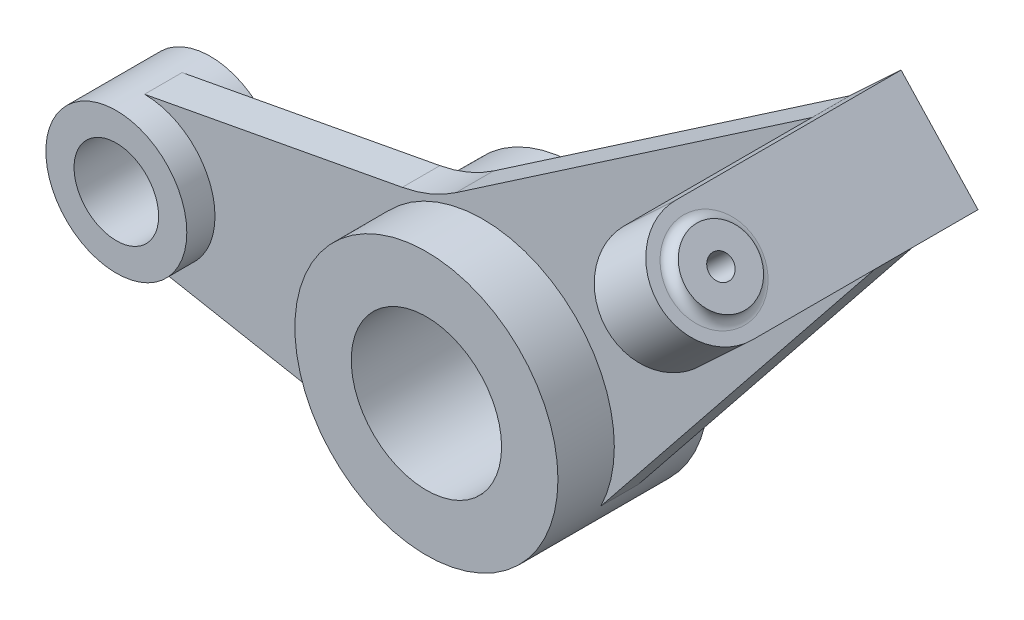
ISO-10303-21;
HEADER;
FILE_DESCRIPTION(('STEP AP214'),'2;1');
FILE_NAME('part.step','',(''),(''),'','','');
FILE_SCHEMA(('AUTOMOTIVE_DESIGN { 1 0 10303 214 1 1 1 1 }'));
ENDSEC;
DATA;
#1=APPLICATION_CONTEXT('core data for automotive mechanical design processes');
#2=APPLICATION_PROTOCOL_DEFINITION('international standard','automotive_design',2000,#1);
#3=PRODUCT_CONTEXT('',#1,'mechanical');
#4=PRODUCT('Part','Part','',(#3));
#5=PRODUCT_RELATED_PRODUCT_CATEGORY('part','',(#4));
#6=PRODUCT_DEFINITION_FORMATION('','',#4);
#7=PRODUCT_DEFINITION_CONTEXT('part definition',#1,'design');
#8=PRODUCT_DEFINITION('design','',#6,#7);
#9=PRODUCT_DEFINITION_SHAPE('','',#8);
#10=(LENGTH_UNIT() NAMED_UNIT(*) SI_UNIT(.MILLI.,.METRE.));
#11=(NAMED_UNIT(*) PLANE_ANGLE_UNIT() SI_UNIT($,.RADIAN.));
#12=(NAMED_UNIT(*) SI_UNIT($,.STERADIAN.) SOLID_ANGLE_UNIT());
#13=UNCERTAINTY_MEASURE_WITH_UNIT(LENGTH_MEASURE(1.E-05),#10,'distance_accuracy_value','');
#14=(GEOMETRIC_REPRESENTATION_CONTEXT(3) GLOBAL_UNCERTAINTY_ASSIGNED_CONTEXT((#13)) GLOBAL_UNIT_ASSIGNED_CONTEXT((#10,
#11,#12)) REPRESENTATION_CONTEXT('',''));
#15=CARTESIAN_POINT('',(0.,0.,0.));
#16=DIRECTION('',(0.,0.,1.));
#17=DIRECTION('',(1.,0.,0.));
#18=AXIS2_PLACEMENT_3D('',#15,#16,#17);
#19=CARTESIAN_POINT('',(81.0411712767887,91.980044347055,56.));
#20=DIRECTION('',(0.731353701619169,0.6819983600625,0.));
#21=DIRECTION('',(-0.6819983600625,0.731353701619169,0.));
#22=AXIS2_PLACEMENT_3D('',#19,#20,#21);
#23=PLANE('',#22);
#24=CARTESIAN_POINT('',(89.2251515975386,83.203799927625,44.));
#25=DIRECTION('',(0.731353701619169,0.6819983600625,0.));
#26=DIRECTION('',(-0.6819983600625,0.731353701619169,0.));
#27=AXIS2_PLACEMENT_3D('',#24,#25,#26);
#28=CIRCLE('',#27,9.5);
#29=CARTESIAN_POINT('',(82.7461671769449,90.1516600930071,44.));
#30=VERTEX_POINT('',#29);
#31=EDGE_CURVE('E14',#30,#30,#28,.F.);
#32=ORIENTED_EDGE('',*,*,#31,.T.);
#33=EDGE_LOOP('',(#32));
#34=FACE_BOUND('',#33,.T.);
#35=CARTESIAN_POINT('',(89.2251515975386,83.2037999276251,44.));
#36=DIRECTION('',(0.73135370161917,0.681998360062499,0.));
#37=DIRECTION('',(-0.681998360062499,0.73135370161917,0.));
#38=AXIS2_PLACEMENT_3D('',#35,#36,#37);
#39=CIRCLE('',#38,12.);
#40=CARTESIAN_POINT('',(81.0411712767887,91.980044347055,44.));
#41=VERTEX_POINT('',#40);
#42=CARTESIAN_POINT('',(97.4091319182887,74.4275555081949,44.));
#43=VERTEX_POINT('',#42);
#44=EDGE_CURVE('E147',#41,#43,#39,.T.);
#45=ORIENTED_EDGE('',*,*,#44,.T.);
#46=DIRECTION('',(0.,0.,-1.));
#47=VECTOR('',#46,1.);
#48=CARTESIAN_POINT('',(97.4091319182887,74.4275555081949,56.));
#49=LINE('',#48,#47);
#50=CARTESIAN_POINT('',(97.4091319182887,74.4275555081949,-4.));
#51=VERTEX_POINT('',#50);
#52=EDGE_CURVE('E151',#43,#51,#49,.T.);
#53=ORIENTED_EDGE('',*,*,#52,.T.);
#54=DIRECTION('',(0.6819983600625,-0.731353701619169,0.));
#55=VECTOR('',#54,1.);
#56=CARTESIAN_POINT('',(81.0411712767887,91.980044347055,-4.));
#57=LINE('',#56,#55);
#58=CARTESIAN_POINT('',(81.0411712767887,91.980044347055,-4.));
#59=VERTEX_POINT('',#58);
#60=EDGE_CURVE('E363',#59,#51,#57,.T.);
#61=ORIENTED_EDGE('',*,*,#60,.F.);
#62=DIRECTION('',(0.,0.,-1.));
#63=VECTOR('',#62,1.);
#64=CARTESIAN_POINT('',(81.0411712767887,91.980044347055,56.));
#65=LINE('',#64,#63);
#66=EDGE_CURVE('E153',#41,#59,#65,.T.);
#67=ORIENTED_EDGE('',*,*,#66,.F.);
#68=EDGE_LOOP('',(#45,#53,#61,#67));
#69=FACE_BOUND('',#68,.T.);
#70=ADVANCED_FACE('F63',(#34,#69),#23,.T.);
#71=CARTESIAN_POINT('',(70.0708657525011,81.7500689461175,56.));
#72=DIRECTION('',(-0.731353701619169,-0.6819983600625,0.));
#73=DIRECTION('',(0.6819983600625,-0.731353701619169,0.));
#74=AXIS2_PLACEMENT_3D('',#71,#72,#73);
#75=PLANE('',#74);
#76=CARTESIAN_POINT('',(78.2548460732511,72.9738245266875,44.));
#77=DIRECTION('',(-0.73135370161917,-0.681998360062499,0.));
#78=DIRECTION('',(0.681998360062499,-0.73135370161917,0.));
#79=AXIS2_PLACEMENT_3D('',#76,#77,#78);
#80=CIRCLE('',#79,6.00000000000001);
#81=CARTESIAN_POINT('',(82.3468362336261,68.5857023169725,44.));
#82=VERTEX_POINT('',#81);
#83=EDGE_CURVE('E375',#82,#82,#80,.T.);
#84=ORIENTED_EDGE('',*,*,#83,.F.);
#85=EDGE_LOOP('',(#84));
#86=FACE_BOUND('',#85,.T.);
#87=DIRECTION('',(0.,0.,-1.));
#88=VECTOR('',#87,1.);
#89=CARTESIAN_POINT('',(86.4388263940011,64.1975801072574,56.));
#90=LINE('',#89,#88);
#91=CARTESIAN_POINT('',(86.4388263940011,64.1975801072575,44.));
#92=VERTEX_POINT('',#91);
#93=CARTESIAN_POINT('',(86.4388263940011,64.1975801072574,4.));
#94=VERTEX_POINT('',#93);
#95=EDGE_CURVE('E171',#92,#94,#90,.T.);
#96=ORIENTED_EDGE('',*,*,#95,.F.);
#97=CARTESIAN_POINT('',(78.254846073251,72.9738245266875,44.));
#98=DIRECTION('',(-0.731353701619169,-0.6819983600625,0.));
#99=DIRECTION('',(0.6819983600625,-0.731353701619169,0.));
#100=AXIS2_PLACEMENT_3D('',#97,#98,#99);
#101=CIRCLE('',#100,12.);
#102=CARTESIAN_POINT('',(70.0708657525012,81.7500689461176,44.));
#103=VERTEX_POINT('',#102);
#104=EDGE_CURVE('E162',#92,#103,#101,.T.);
#105=ORIENTED_EDGE('',*,*,#104,.T.);
#106=DIRECTION('',(0.,0.,-1.));
#107=VECTOR('',#106,1.);
#108=CARTESIAN_POINT('',(70.0708657525011,81.7500689461175,56.));
#109=LINE('',#108,#107);
#110=CARTESIAN_POINT('',(70.0708657525011,81.7500689461175,4.));
#111=VERTEX_POINT('',#110);
#112=EDGE_CURVE('E175',#103,#111,#109,.T.);
#113=ORIENTED_EDGE('',*,*,#112,.T.);
#114=DIRECTION('',(-0.6819983600625,0.731353701619169,0.));
#115=VECTOR('',#114,1.);
#116=CARTESIAN_POINT('',(70.0708657525011,81.7500689461175,4.));
#117=LINE('',#116,#115);
#118=EDGE_CURVE('E186',#94,#111,#117,.T.);
#119=ORIENTED_EDGE('',*,*,#118,.F.);
#120=EDGE_LOOP('',(#96,#105,#113,#119));
#121=FACE_BOUND('',#120,.T.);
#122=ADVANCED_FACE('F278',(#86,#121),#75,.T.);
#123=CARTESIAN_POINT('',(70.0708657525011,81.7500689461175,56.));
#124=DIRECTION('',(-0.681998360062499,0.731353701619169,0.));
#125=DIRECTION('',(-0.73135370161917,-0.6819983600625,0.));
#126=AXIS2_PLACEMENT_3D('',#123,#124,#125);
#127=PLANE('',#126);
#128=ORIENTED_EDGE('',*,*,#112,.F.);
#129=DIRECTION('',(0.73135370161917,0.681998360062499,0.));
#130=VECTOR('',#129,1.);
#131=CARTESIAN_POINT('',(-68.6842836322569,-47.6412011344546,44.));
#132=LINE('',#131,#130);
#133=EDGE_CURVE('E156',#103,#41,#132,.T.);
#134=ORIENTED_EDGE('',*,*,#133,.T.);
#135=ORIENTED_EDGE('',*,*,#66,.T.);
#136=DIRECTION('',(0.731353701619169,0.681998360062499,0.));
#137=VECTOR('',#136,1.);
#138=CARTESIAN_POINT('',(70.0708657525011,81.7500689461175,-4.));
#139=LINE('',#138,#137);
#140=CARTESIAN_POINT('',(70.0708657525011,81.7500689461175,-4.));
#141=VERTEX_POINT('',#140);
#142=EDGE_CURVE('E364',#141,#59,#139,.T.);
#143=ORIENTED_EDGE('',*,*,#142,.F.);
#144=DIRECTION('',(0.,0.,-1.));
#145=VECTOR('',#144,1.);
#146=CARTESIAN_POINT('',(70.0708657525011,81.7500689461175,4.));
#147=LINE('',#146,#145);
#148=EDGE_CURVE('E189',#111,#141,#147,.T.);
#149=ORIENTED_EDGE('',*,*,#148,.F.);
#150=EDGE_LOOP('',(#128,#134,#135,#143,#149));
#151=FACE_BOUND('',#150,.T.);
#152=ADVANCED_FACE('F284',(#151),#127,.T.);
#153=CARTESIAN_POINT('',(-72.,15.,4.));
#154=DIRECTION('',(0.184117158780707,-0.982904304519275,0.));
#155=DIRECTION('',(0.982904304519275,0.184117158780707,0.));
#156=AXIS2_PLACEMENT_3D('',#153,#154,#155);
#157=PLANE('',#156);
#158=DIRECTION('',(-0.982904304519275,-0.184117158780707,0.));
#159=VECTOR('',#158,1.);
#160=CARTESIAN_POINT('',(-72.,15.,4.));
#161=LINE('',#160,#159);
#162=CARTESIAN_POINT('',(-17.1252828665344,25.2791054643413,4.));
#163=VERTEX_POINT('',#162);
#164=CARTESIAN_POINT('',(-72.,15.,4.));
#165=VERTEX_POINT('',#164);
#166=EDGE_CURVE('E222',#163,#165,#161,.T.);
#167=ORIENTED_EDGE('',*,*,#166,.F.);
#168=DIRECTION('',(0.,0.,-1.));
#169=VECTOR('',#168,1.);
#170=CARTESIAN_POINT('',(-17.1252828665344,25.2791054643413,-4.));
#171=LINE('',#170,#169);
#172=CARTESIAN_POINT('',(-17.1252828665344,25.2791054643413,-4.));
#173=VERTEX_POINT('',#172);
#174=EDGE_CURVE('E249',#163,#173,#171,.T.);
#175=ORIENTED_EDGE('',*,*,#174,.T.);
#176=DIRECTION('',(-0.982904304519275,-0.184117158780707,0.));
#177=VECTOR('',#176,1.);
#178=CARTESIAN_POINT('',(-72.,15.,-4.));
#179=LINE('',#178,#177);
#180=CARTESIAN_POINT('',(-72.,15.,-4.));
#181=VERTEX_POINT('',#180);
#182=EDGE_CURVE('E217',#173,#181,#179,.T.);
#183=ORIENTED_EDGE('',*,*,#182,.T.);
#184=DIRECTION('',(0.,0.,-1.));
#185=VECTOR('',#184,1.);
#186=CARTESIAN_POINT('',(-72.,15.,4.));
#187=LINE('',#186,#185);
#188=EDGE_CURVE('E224',#165,#181,#187,.T.);
#189=ORIENTED_EDGE('',*,*,#188,.F.);
#190=EDGE_LOOP('',(#167,#175,#183,#189));
#191=FACE_BOUND('',#190,.T.);
#192=ADVANCED_FACE('F263',(#191),#157,.F.);
#193=CARTESIAN_POINT('',(0.,0.,16.));
#194=DIRECTION('',(0.,0.,1.));
#195=DIRECTION('',(1.,0.,0.));
#196=AXIS2_PLACEMENT_3D('',#193,#194,#195);
#197=PLANE('',#196);
#198=CARTESIAN_POINT('',(0.,0.,16.));
#199=DIRECTION('',(0.,0.,1.));
#200=DIRECTION('',(1.,0.,0.));
#201=AXIS2_PLACEMENT_3D('',#198,#199,#200);
#202=CIRCLE('',#201,28.);
#203=CARTESIAN_POINT('',(28.,0.,16.));
#204=VERTEX_POINT('',#203);
#205=EDGE_CURVE('E246',#204,#204,#202,.T.);
#206=ORIENTED_EDGE('',*,*,#205,.T.);
#207=EDGE_LOOP('',(#206));
#208=FACE_BOUND('',#207,.T.);
#209=CARTESIAN_POINT('',(0.,0.,16.));
#210=DIRECTION('',(0.,0.,1.));
#211=DIRECTION('',(1.,0.,0.));
#212=AXIS2_PLACEMENT_3D('',#209,#210,#211);
#213=CIRCLE('',#212,16.);
#214=CARTESIAN_POINT('',(16.,0.,16.));
#215=VERTEX_POINT('',#214);
#216=EDGE_CURVE('E240',#215,#215,#213,.T.);
#217=ORIENTED_EDGE('',*,*,#216,.F.);
#218=EDGE_LOOP('',(#217));
#219=FACE_BOUND('',#218,.T.);
#220=ADVANCED_FACE('F324',(#208,#219),#197,.T.);
#221=CARTESIAN_POINT('',(0.,0.,-16.));
#222=DIRECTION('',(0.,0.,1.));
#223=DIRECTION('',(1.,0.,0.));
#224=AXIS2_PLACEMENT_3D('',#221,#222,#223);
#225=PLANE('',#224);
#226=CARTESIAN_POINT('',(0.,0.,-16.));
#227=DIRECTION('',(0.,0.,1.));
#228=DIRECTION('',(1.,0.,0.));
#229=AXIS2_PLACEMENT_3D('',#226,#227,#228);
#230=CIRCLE('',#229,28.);
#231=CARTESIAN_POINT('',(28.,0.,-16.));
#232=VERTEX_POINT('',#231);
#233=EDGE_CURVE('E243',#232,#232,#230,.T.);
#234=ORIENTED_EDGE('',*,*,#233,.F.);
#235=EDGE_LOOP('',(#234));
#236=FACE_BOUND('',#235,.T.);
#237=CARTESIAN_POINT('',(0.,0.,-16.));
#238=DIRECTION('',(0.,0.,1.));
#239=DIRECTION('',(1.,0.,0.));
#240=AXIS2_PLACEMENT_3D('',#237,#238,#239);
#241=CIRCLE('',#240,16.);
#242=CARTESIAN_POINT('',(16.,0.,-16.));
#243=VERTEX_POINT('',#242);
#244=EDGE_CURVE('E239',#243,#243,#241,.T.);
#245=ORIENTED_EDGE('',*,*,#244,.T.);
#246=EDGE_LOOP('',(#245));
#247=FACE_BOUND('',#246,.T.);
#248=ADVANCED_FACE('F335',(#236,#247),#225,.F.);
#249=CARTESIAN_POINT('',(0.,0.,16.));
#250=DIRECTION('',(0.,0.,-1.));
#251=DIRECTION('',(-1.,0.,0.));
#252=AXIS2_PLACEMENT_3D('',#249,#250,#251);
#253=CYLINDRICAL_SURFACE('',#252,28.);
#254=DIRECTION('',(0.,0.,-1.));
#255=VECTOR('',#254,1.);
#256=CARTESIAN_POINT('',(25.1229928999302,-12.362654559198,4.));
#257=LINE('',#256,#255);
#258=CARTESIAN_POINT('',(25.1229928999301,-12.362654559198,4.));
#259=VERTEX_POINT('',#258);
#260=CARTESIAN_POINT('',(25.1229928999301,-12.362654559198,-4.));
#261=VERTEX_POINT('',#260);
#262=EDGE_CURVE('E197',#259,#261,#257,.T.);
#263=ORIENTED_EDGE('',*,*,#262,.F.);
#264=CARTESIAN_POINT('',(0.,0.,4.));
#265=DIRECTION('',(0.,0.,-1.));
#266=DIRECTION('',(1.,0.,0.));
#267=AXIS2_PLACEMENT_3D('',#264,#265,#266);
#268=CIRCLE('',#267,28.);
#269=CARTESIAN_POINT('',(-5.15528044585978,-27.5213205265397,4.));
#270=VERTEX_POINT('',#269);
#271=EDGE_CURVE('E220',#270,#259,#268,.T.);
#272=ORIENTED_EDGE('',*,*,#271,.F.);
#273=DIRECTION('',(0.,0.,-1.));
#274=VECTOR('',#273,1.);
#275=CARTESIAN_POINT('',(-5.15528044585979,-27.5213205265397,4.));
#276=LINE('',#275,#274);
#277=CARTESIAN_POINT('',(-5.15528044585979,-27.5213205265397,-4.));
#278=VERTEX_POINT('',#277);
#279=EDGE_CURVE('E235',#270,#278,#276,.T.);
#280=ORIENTED_EDGE('',*,*,#279,.T.);
#281=CARTESIAN_POINT('',(0.,0.,-4.));
#282=DIRECTION('',(0.,0.,-1.));
#283=DIRECTION('',(1.,0.,0.));
#284=AXIS2_PLACEMENT_3D('',#281,#282,#283);
#285=CIRCLE('',#284,28.);
#286=EDGE_CURVE('E230',#278,#261,#285,.T.);
#287=ORIENTED_EDGE('',*,*,#286,.T.);
#288=EDGE_LOOP('',(#263,#272,#280,#287));
#289=FACE_BOUND('',#288,.T.);
#290=ORIENTED_EDGE('',*,*,#205,.F.);
#291=EDGE_LOOP('',(#290));
#292=FACE_BOUND('',#291,.T.);
#293=ORIENTED_EDGE('',*,*,#233,.T.);
#294=EDGE_LOOP('',(#293));
#295=FACE_BOUND('',#294,.T.);
#296=ADVANCED_FACE('F331',(#289,#292,#295),#253,.T.);
#297=CARTESIAN_POINT('',(0.,0.,16.));
#298=DIRECTION('',(0.,0.,-1.));
#299=DIRECTION('',(-1.,0.,0.));
#300=AXIS2_PLACEMENT_3D('',#297,#298,#299);
#301=CYLINDRICAL_SURFACE('',#300,16.);
#302=ORIENTED_EDGE('',*,*,#216,.T.);
#303=EDGE_LOOP('',(#302));
#304=FACE_BOUND('',#303,.T.);
#305=ORIENTED_EDGE('',*,*,#244,.F.);
#306=EDGE_LOOP('',(#305));
#307=FACE_BOUND('',#306,.T.);
#308=ADVANCED_FACE('F327',(#304,#307),#301,.F.);
#309=CARTESIAN_POINT('',(-72.,-15.,4.));
#310=DIRECTION('',(0.184117158780706,0.982904304519275,0.));
#311=DIRECTION('',(-0.982904304519275,0.184117158780706,0.));
#312=AXIS2_PLACEMENT_3D('',#309,#310,#311);
#313=PLANE('',#312);
#314=DIRECTION('',(0.982904304519275,-0.184117158780706,0.));
#315=VECTOR('',#314,1.);
#316=CARTESIAN_POINT('',(-72.,-15.,-4.));
#317=LINE('',#316,#315);
#318=CARTESIAN_POINT('',(-72.,-15.,-4.));
#319=VERTEX_POINT('',#318);
#320=EDGE_CURVE('E227',#319,#278,#317,.T.);
#321=ORIENTED_EDGE('',*,*,#320,.T.);
#322=ORIENTED_EDGE('',*,*,#279,.F.);
#323=DIRECTION('',(0.982904304519275,-0.184117158780706,0.));
#324=VECTOR('',#323,1.);
#325=CARTESIAN_POINT('',(-72.,-15.,4.));
#326=LINE('',#325,#324);
#327=CARTESIAN_POINT('',(-72.,-15.,4.));
#328=VERTEX_POINT('',#327);
#329=EDGE_CURVE('E216',#328,#270,#326,.T.);
#330=ORIENTED_EDGE('',*,*,#329,.F.);
#331=DIRECTION('',(0.,0.,-1.));
#332=VECTOR('',#331,1.);
#333=CARTESIAN_POINT('',(-72.,-15.,4.));
#334=LINE('',#333,#332);
#335=EDGE_CURVE('E237',#328,#319,#334,.T.);
#336=ORIENTED_EDGE('',*,*,#335,.T.);
#337=EDGE_LOOP('',(#321,#322,#330,#336));
#338=FACE_BOUND('',#337,.T.);
#339=ADVANCED_FACE('F319',(#338),#313,.F.);
#340=CARTESIAN_POINT('',(-72.,0.,4.));
#341=DIRECTION('',(0.,0.,1.));
#342=DIRECTION('',(1.,0.,0.));
#343=AXIS2_PLACEMENT_3D('',#340,#341,#342);
#344=PLANE('',#343);
#345=CARTESIAN_POINT('',(-72.,0.,4.));
#346=DIRECTION('',(0.,0.,-1.));
#347=DIRECTION('',(1.,0.,0.));
#348=AXIS2_PLACEMENT_3D('',#345,#346,#347);
#349=CIRCLE('',#348,15.);
#350=EDGE_CURVE('E213',#165,#328,#349,.T.);
#351=ORIENTED_EDGE('',*,*,#350,.T.);
#352=ORIENTED_EDGE('',*,*,#329,.T.);
#353=ORIENTED_EDGE('',*,*,#271,.T.);
#354=DIRECTION('',(0.625115474739944,0.780532281997775,0.));
#355=VECTOR('',#354,1.);
#356=CARTESIAN_POINT('',(86.4388263940011,64.1975801072574,4.));
#357=LINE('',#356,#355);
#358=EDGE_CURVE('E182',#259,#94,#357,.T.);
#359=ORIENTED_EDGE('',*,*,#358,.T.);
#360=ORIENTED_EDGE('',*,*,#118,.T.);
#361=DIRECTION('',(-0.825844339942114,-0.563898152316155,0.));
#362=VECTOR('',#361,1.);
#363=CARTESIAN_POINT('',(70.0708657525011,81.7500689461175,4.));
#364=LINE('',#363,#362);
#365=CARTESIAN_POINT('',(-5.73185306047093,29.9909044016561,4.));
#366=VERTEX_POINT('',#365);
#367=EDGE_CURVE('E180',#111,#366,#364,.T.);
#368=ORIENTED_EDGE('',*,*,#367,.T.);
#369=CARTESIAN_POINT('',(-22.6487976299556,54.7662345999195,4.));
#370=DIRECTION('',(0.,0.,1.));
#371=DIRECTION('',(1.,0.,0.));
#372=AXIS2_PLACEMENT_3D('',#369,#370,#371);
#373=CIRCLE('',#372,30.);
#374=EDGE_CURVE('E71',#366,#163,#373,.F.);
#375=ORIENTED_EDGE('',*,*,#374,.T.);
#376=ORIENTED_EDGE('',*,*,#166,.T.);
#377=EDGE_LOOP('',(#351,#352,#353,#359,#360,#368,#375,#376));
#378=FACE_BOUND('',#377,.T.);
#379=ADVANCED_FACE('F258',(#378),#344,.T.);
#380=CARTESIAN_POINT('',(-72.,0.,-4.));
#381=DIRECTION('',(0.,0.,1.));
#382=DIRECTION('',(1.,0.,0.));
#383=AXIS2_PLACEMENT_3D('',#380,#381,#382);
#384=PLANE('',#383);
#385=CARTESIAN_POINT('',(-72.,0.,-4.));
#386=DIRECTION('',(0.,0.,-1.));
#387=DIRECTION('',(1.,0.,0.));
#388=AXIS2_PLACEMENT_3D('',#385,#386,#387);
#389=CIRCLE('',#388,15.);
#390=EDGE_CURVE('E210',#181,#319,#389,.T.);
#391=ORIENTED_EDGE('',*,*,#390,.F.);
#392=ORIENTED_EDGE('',*,*,#182,.F.);
#393=CARTESIAN_POINT('',(-22.6487976299556,54.7662345999195,-4.));
#394=DIRECTION('',(0.,0.,1.));
#395=DIRECTION('',(1.,0.,0.));
#396=AXIS2_PLACEMENT_3D('',#393,#394,#395);
#397=CIRCLE('',#396,30.);
#398=CARTESIAN_POINT('',(-5.73185306047093,29.9909044016561,-4.));
#399=VERTEX_POINT('',#398);
#400=EDGE_CURVE('E86',#173,#399,#397,.T.);
#401=ORIENTED_EDGE('',*,*,#400,.T.);
#402=DIRECTION('',(-0.825844339942114,-0.563898152316155,0.));
#403=VECTOR('',#402,1.);
#404=CARTESIAN_POINT('',(70.0708657525011,81.7500689461175,-4.));
#405=LINE('',#404,#403);
#406=EDGE_CURVE('E173',#141,#399,#405,.T.);
#407=ORIENTED_EDGE('',*,*,#406,.F.);
#408=ORIENTED_EDGE('',*,*,#142,.T.);
#409=ORIENTED_EDGE('',*,*,#60,.T.);
#410=DIRECTION('',(-0.731353701619169,-0.6819983600625,0.));
#411=VECTOR('',#410,1.);
#412=CARTESIAN_POINT('',(86.4388263940011,64.1975801072574,-4.));
#413=LINE('',#412,#411);
#414=CARTESIAN_POINT('',(86.4388263940011,64.1975801072574,-4.));
#415=VERTEX_POINT('',#414);
#416=EDGE_CURVE('E170',#51,#415,#413,.T.);
#417=ORIENTED_EDGE('',*,*,#416,.T.);
#418=DIRECTION('',(0.625115474739944,0.780532281997775,0.));
#419=VECTOR('',#418,1.);
#420=CARTESIAN_POINT('',(86.4388263940011,64.1975801072574,-4.));
#421=LINE('',#420,#419);
#422=EDGE_CURVE('E183',#261,#415,#421,.T.);
#423=ORIENTED_EDGE('',*,*,#422,.F.);
#424=ORIENTED_EDGE('',*,*,#286,.F.);
#425=ORIENTED_EDGE('',*,*,#320,.F.);
#426=EDGE_LOOP('',(#391,#392,#401,#407,#408,#409,#417,#423,#424,#425));
#427=FACE_BOUND('',#426,.T.);
#428=ADVANCED_FACE('F309',(#427),#384,.F.);
#429=CARTESIAN_POINT('',(-72.,0.,10.));
#430=DIRECTION('',(0.,0.,1.));
#431=DIRECTION('',(1.,0.,0.));
#432=AXIS2_PLACEMENT_3D('',#429,#430,#431);
#433=PLANE('',#432);
#434=CARTESIAN_POINT('',(-72.,0.,10.));
#435=DIRECTION('',(0.,0.,1.));
#436=DIRECTION('',(1.,0.,0.));
#437=AXIS2_PLACEMENT_3D('',#434,#435,#436);
#438=CIRCLE('',#437,15.);
#439=CARTESIAN_POINT('',(-57.,0.,10.));
#440=VERTEX_POINT('',#439);
#441=EDGE_CURVE('E207',#440,#440,#438,.T.);
#442=ORIENTED_EDGE('',*,*,#441,.T.);
#443=EDGE_LOOP('',(#442));
#444=FACE_BOUND('',#443,.T.);
#445=CARTESIAN_POINT('',(-72.,0.,10.));
#446=DIRECTION('',(0.,0.,1.));
#447=DIRECTION('',(1.,0.,0.));
#448=AXIS2_PLACEMENT_3D('',#445,#446,#447);
#449=CIRCLE('',#448,9.);
#450=CARTESIAN_POINT('',(-63.,0.,10.));
#451=VERTEX_POINT('',#450);
#452=EDGE_CURVE('E201',#451,#451,#449,.T.);
#453=ORIENTED_EDGE('',*,*,#452,.F.);
#454=EDGE_LOOP('',(#453));
#455=FACE_BOUND('',#454,.T.);
#456=ADVANCED_FACE('F305',(#444,#455),#433,.T.);
#457=CARTESIAN_POINT('',(-72.,0.,-10.));
#458=DIRECTION('',(0.,0.,1.));
#459=DIRECTION('',(1.,0.,0.));
#460=AXIS2_PLACEMENT_3D('',#457,#458,#459);
#461=PLANE('',#460);
#462=CARTESIAN_POINT('',(-72.,0.,-10.));
#463=DIRECTION('',(0.,0.,1.));
#464=DIRECTION('',(1.,0.,0.));
#465=AXIS2_PLACEMENT_3D('',#462,#463,#464);
#466=CIRCLE('',#465,15.);
#467=CARTESIAN_POINT('',(-57.,0.,-10.));
#468=VERTEX_POINT('',#467);
#469=EDGE_CURVE('E204',#468,#468,#466,.T.);
#470=ORIENTED_EDGE('',*,*,#469,.F.);
#471=EDGE_LOOP('',(#470));
#472=FACE_BOUND('',#471,.T.);
#473=CARTESIAN_POINT('',(-72.,0.,-10.));
#474=DIRECTION('',(0.,0.,1.));
#475=DIRECTION('',(1.,0.,0.));
#476=AXIS2_PLACEMENT_3D('',#473,#474,#475);
#477=CIRCLE('',#476,9.);
#478=CARTESIAN_POINT('',(-63.,0.,-10.));
#479=VERTEX_POINT('',#478);
#480=EDGE_CURVE('E200',#479,#479,#477,.T.);
#481=ORIENTED_EDGE('',*,*,#480,.T.);
#482=EDGE_LOOP('',(#481));
#483=FACE_BOUND('',#482,.T.);
#484=ADVANCED_FACE('F308',(#472,#483),#461,.F.);
#485=CARTESIAN_POINT('',(-72.,0.,10.));
#486=DIRECTION('',(0.,0.,-1.));
#487=DIRECTION('',(-1.,0.,0.));
#488=AXIS2_PLACEMENT_3D('',#485,#486,#487);
#489=CYLINDRICAL_SURFACE('',#488,15.);
#490=ORIENTED_EDGE('',*,*,#350,.F.);
#491=ORIENTED_EDGE('',*,*,#188,.T.);
#492=ORIENTED_EDGE('',*,*,#390,.T.);
#493=ORIENTED_EDGE('',*,*,#335,.F.);
#494=EDGE_LOOP('',(#490,#491,#492,#493));
#495=FACE_BOUND('',#494,.T.);
#496=ORIENTED_EDGE('',*,*,#441,.F.);
#497=EDGE_LOOP('',(#496));
#498=FACE_BOUND('',#497,.T.);
#499=ORIENTED_EDGE('',*,*,#469,.T.);
#500=EDGE_LOOP('',(#499));
#501=FACE_BOUND('',#500,.T.);
#502=ADVANCED_FACE('F303',(#495,#498,#501),#489,.T.);
#503=CARTESIAN_POINT('',(-72.,0.,10.));
#504=DIRECTION('',(0.,0.,-1.));
#505=DIRECTION('',(-1.,0.,0.));
#506=AXIS2_PLACEMENT_3D('',#503,#504,#505);
#507=CYLINDRICAL_SURFACE('',#506,9.);
#508=ORIENTED_EDGE('',*,*,#452,.T.);
#509=EDGE_LOOP('',(#508));
#510=FACE_BOUND('',#509,.T.);
#511=ORIENTED_EDGE('',*,*,#480,.F.);
#512=EDGE_LOOP('',(#511));
#513=FACE_BOUND('',#512,.T.);
#514=ADVANCED_FACE('F300',(#510,#513),#507,.F.);
#515=CARTESIAN_POINT('',(70.0708657525011,81.7500689461175,4.));
#516=DIRECTION('',(0.563898152316155,-0.825844339942114,0.));
#517=DIRECTION('',(0.825844339942114,0.563898152316155,0.));
#518=AXIS2_PLACEMENT_3D('',#515,#516,#517);
#519=PLANE('',#518);
#520=ORIENTED_EDGE('',*,*,#406,.T.);
#521=DIRECTION('',(0.,0.,-1.));
#522=VECTOR('',#521,1.);
#523=CARTESIAN_POINT('',(-5.73185306047093,29.9909044016561,4.));
#524=LINE('',#523,#522);
#525=EDGE_CURVE('E78',#399,#366,#524,.F.);
#526=ORIENTED_EDGE('',*,*,#525,.T.);
#527=ORIENTED_EDGE('',*,*,#367,.F.);
#528=ORIENTED_EDGE('',*,*,#148,.T.);
#529=EDGE_LOOP('',(#520,#526,#527,#528));
#530=FACE_BOUND('',#529,.T.);
#531=ADVANCED_FACE('F296',(#530),#519,.F.);
#532=CARTESIAN_POINT('',(86.4388263940011,64.1975801072574,4.));
#533=DIRECTION('',(-0.780532281997775,0.625115474739944,0.));
#534=DIRECTION('',(-0.625115474739944,-0.780532281997775,0.));
#535=AXIS2_PLACEMENT_3D('',#532,#533,#534);
#536=PLANE('',#535);
#537=ORIENTED_EDGE('',*,*,#422,.T.);
#538=DIRECTION('',(0.,0.,-1.));
#539=VECTOR('',#538,1.);
#540=CARTESIAN_POINT('',(86.4388263940011,64.1975801072574,4.));
#541=LINE('',#540,#539);
#542=EDGE_CURVE('E195',#94,#415,#541,.T.);
#543=ORIENTED_EDGE('',*,*,#542,.F.);
#544=ORIENTED_EDGE('',*,*,#358,.F.);
#545=ORIENTED_EDGE('',*,*,#262,.T.);
#546=EDGE_LOOP('',(#537,#543,#544,#545));
#547=FACE_BOUND('',#546,.T.);
#548=ADVANCED_FACE('F293',(#547),#536,.F.);
#549=CARTESIAN_POINT('',(86.4388263940011,64.1975801072574,56.));
#550=DIRECTION('',(0.6819983600625,-0.731353701619169,0.));
#551=DIRECTION('',(0.731353701619169,0.6819983600625,0.));
#552=AXIS2_PLACEMENT_3D('',#549,#550,#551);
#553=PLANE('',#552);
#554=DIRECTION('',(0.73135370161917,0.681998360062499,0.));
#555=VECTOR('',#554,1.);
#556=CARTESIAN_POINT('',(-52.3163229907569,-65.1936899733147,44.));
#557=LINE('',#556,#555);
#558=EDGE_CURVE('E157',#92,#43,#557,.T.);
#559=ORIENTED_EDGE('',*,*,#558,.F.);
#560=ORIENTED_EDGE('',*,*,#95,.T.);
#561=ORIENTED_EDGE('',*,*,#542,.T.);
#562=ORIENTED_EDGE('',*,*,#416,.F.);
#563=ORIENTED_EDGE('',*,*,#52,.F.);
#564=EDGE_LOOP('',(#559,#560,#561,#562,#563));
#565=FACE_BOUND('',#564,.T.);
#566=ADVANCED_FACE('F168',(#565),#553,.T.);
#567=CARTESIAN_POINT('',(-60.500303311507,-56.4174455538846,44.));
#568=DIRECTION('',(0.73135370161917,0.681998360062499,0.));
#569=DIRECTION('',(-0.681998360062499,0.73135370161917,0.));
#570=AXIS2_PLACEMENT_3D('',#567,#568,#569);
#571=CYLINDRICAL_SURFACE('',#570,12.);
#572=ORIENTED_EDGE('',*,*,#104,.F.);
#573=ORIENTED_EDGE('',*,*,#558,.T.);
#574=ORIENTED_EDGE('',*,*,#44,.F.);
#575=ORIENTED_EDGE('',*,*,#133,.F.);
#576=EDGE_LOOP('',(#572,#573,#574,#575));
#577=FACE_BOUND('',#576,.T.);
#578=ADVANCED_FACE('F160',(#577),#571,.T.);
#579=CARTESIAN_POINT('',(78.2548460732511,72.9738245266875,44.));
#580=DIRECTION('',(-0.73135370161917,-0.681998360062499,0.));
#581=DIRECTION('',(0.681998360062499,-0.73135370161917,0.));
#582=AXIS2_PLACEMENT_3D('',#579,#580,#581);
#583=CYLINDRICAL_SURFACE('',#582,2.50000000000001);
#584=CARTESIAN_POINT('',(82.6429682829661,77.0658146870625,44.));
#585=DIRECTION('',(-0.73135370161917,-0.681998360062499,0.));
#586=DIRECTION('',(0.681998360062499,-0.73135370161917,0.));
#587=AXIS2_PLACEMENT_3D('',#584,#585,#586);
#588=CIRCLE('',#587,2.50000000000002);
#589=CARTESIAN_POINT('',(84.3479641831224,75.2374304330146,44.));
#590=VERTEX_POINT('',#589);
#591=EDGE_CURVE('E165',#590,#590,#588,.T.);
#592=ORIENTED_EDGE('',*,*,#591,.T.);
#593=EDGE_LOOP('',(#592));
#594=FACE_BOUND('',#593,.T.);
#595=CARTESIAN_POINT('',(90.687859000777,84.56779664775,44.));
#596=DIRECTION('',(0.73135370161917,0.681998360062499,0.));
#597=DIRECTION('',(-0.681998360062499,0.73135370161917,0.));
#598=AXIS2_PLACEMENT_3D('',#595,#596,#597);
#599=CIRCLE('',#598,2.50000000000003);
#600=CARTESIAN_POINT('',(88.9828631006207,86.396180901798,44.));
#601=VERTEX_POINT('',#600);
#602=EDGE_CURVE('E381',#601,#601,#599,.T.);
#603=ORIENTED_EDGE('',*,*,#602,.T.);
#604=EDGE_LOOP('',(#603));
#605=FACE_BOUND('',#604,.T.);
#606=ADVANCED_FACE('F385',(#594,#605),#583,.F.);
#607=CARTESIAN_POINT('',(82.6429682829661,77.0658146870625,46.5));
#608=DIRECTION('',(0.73135370161917,0.681998360062499,0.));
#609=DIRECTION('',(-0.681998360062499,0.73135370161917,0.));
#610=AXIS2_PLACEMENT_3D('',#607,#608,#609);
#611=PLANE('',#610);
#612=ORIENTED_EDGE('',*,*,#591,.F.);
#613=EDGE_LOOP('',(#612));
#614=FACE_BOUND('',#613,.T.);
#615=CARTESIAN_POINT('',(82.6429682829661,77.0658146870625,44.));
#616=DIRECTION('',(-0.73135370161917,-0.681998360062499,0.));
#617=DIRECTION('',(0.681998360062499,-0.73135370161917,0.));
#618=AXIS2_PLACEMENT_3D('',#615,#616,#617);
#619=CIRCLE('',#618,6.00000000000001);
#620=CARTESIAN_POINT('',(86.7349584433411,72.6776924773475,44.));
#621=VERTEX_POINT('',#620);
#622=EDGE_CURVE('E372',#621,#621,#619,.T.);
#623=ORIENTED_EDGE('',*,*,#622,.T.);
#624=EDGE_LOOP('',(#623));
#625=FACE_BOUND('',#624,.T.);
#626=ADVANCED_FACE('F388',(#614,#625),#611,.F.);
#627=CARTESIAN_POINT('',(78.2548460732511,72.9738245266875,44.));
#628=DIRECTION('',(-0.73135370161917,-0.681998360062499,0.));
#629=DIRECTION('',(0.681998360062499,-0.73135370161917,0.));
#630=AXIS2_PLACEMENT_3D('',#627,#628,#629);
#631=CYLINDRICAL_SURFACE('',#630,6.00000000000001);
#632=ORIENTED_EDGE('',*,*,#622,.F.);
#633=EDGE_LOOP('',(#632));
#634=FACE_BOUND('',#633,.T.);
#635=ORIENTED_EDGE('',*,*,#83,.T.);
#636=EDGE_LOOP('',(#635));
#637=FACE_BOUND('',#636,.T.);
#638=ADVANCED_FACE('F273',(#634,#637),#631,.F.);
#639=CARTESIAN_POINT('',(90.687859000777,84.56779664775,44.));
#640=DIRECTION('',(0.73135370161917,0.681998360062499,0.));
#641=DIRECTION('',(-0.681998360062499,0.73135370161917,0.));
#642=AXIS2_PLACEMENT_3D('',#639,#640,#641);
#643=PLANE('',#642);
#644=CARTESIAN_POINT('',(90.687859000777,84.56779664775,44.));
#645=DIRECTION('',(0.73135370161917,0.681998360062499,0.));
#646=DIRECTION('',(-0.681998360062499,0.73135370161917,0.));
#647=AXIS2_PLACEMENT_3D('',#644,#645,#646);
#648=CIRCLE('',#647,7.5);
#649=CARTESIAN_POINT('',(85.5728713003082,90.0529494098938,44.));
#650=VERTEX_POINT('',#649);
#651=EDGE_CURVE('E378',#650,#650,#648,.T.);
#652=ORIENTED_EDGE('',*,*,#651,.T.);
#653=EDGE_LOOP('',(#652));
#654=FACE_BOUND('',#653,.T.);
#655=ORIENTED_EDGE('',*,*,#602,.F.);
#656=EDGE_LOOP('',(#655));
#657=FACE_BOUND('',#656,.T.);
#658=ADVANCED_FACE('F267',(#654,#657),#643,.T.);
#659=CARTESIAN_POINT('',(-22.6487976299556,54.7662345999195,4.));
#660=DIRECTION('',(0.,0.,1.));
#661=DIRECTION('',(1.,0.,0.));
#662=AXIS2_PLACEMENT_3D('',#659,#660,#661);
#663=CYLINDRICAL_SURFACE('',#662,30.);
#664=ORIENTED_EDGE('',*,*,#374,.F.);
#665=ORIENTED_EDGE('',*,*,#525,.F.);
#666=ORIENTED_EDGE('',*,*,#400,.F.);
#667=ORIENTED_EDGE('',*,*,#174,.F.);
#668=EDGE_LOOP('',(#664,#665,#666,#667));
#669=FACE_BOUND('',#668,.T.);
#670=ADVANCED_FACE('F265',(#669),#663,.F.);
#671=CARTESIAN_POINT('',(90.6878590007769,84.56779664775,44.));
#672=DIRECTION('',(0.731353701619169,0.6819983600625,0.));
#673=DIRECTION('',(-0.6819983600625,0.731353701619169,0.));
#674=AXIS2_PLACEMENT_3D('',#671,#672,#673);
#675=TOROIDAL_SURFACE('',#674,9.5,2.);
#676=ORIENTED_EDGE('',*,*,#31,.F.);
#677=EDGE_LOOP('',(#676));
#678=FACE_BOUND('',#677,.T.);
#679=ORIENTED_EDGE('',*,*,#651,.F.);
#680=EDGE_LOOP('',(#679));
#681=FACE_BOUND('',#680,.T.);
#682=ADVANCED_FACE('F65',(#678,#681),#675,.F.);
#683=CLOSED_SHELL('',(#70,#122,#152,#192,#220,#248,#296,#308,#339,#379,#428,#456,#484,#502,#514,
#531,#548,#566,#578,#606,#626,#638,#658,#670,#682));
#684=MANIFOLD_SOLID_BREP('B2',#683);
#685=ADVANCED_BREP_SHAPE_REPRESENTATION('',(#18,#684),#14);
#686=SHAPE_DEFINITION_REPRESENTATION(#9,#685);
ENDSEC;
END-ISO-10303-21;
